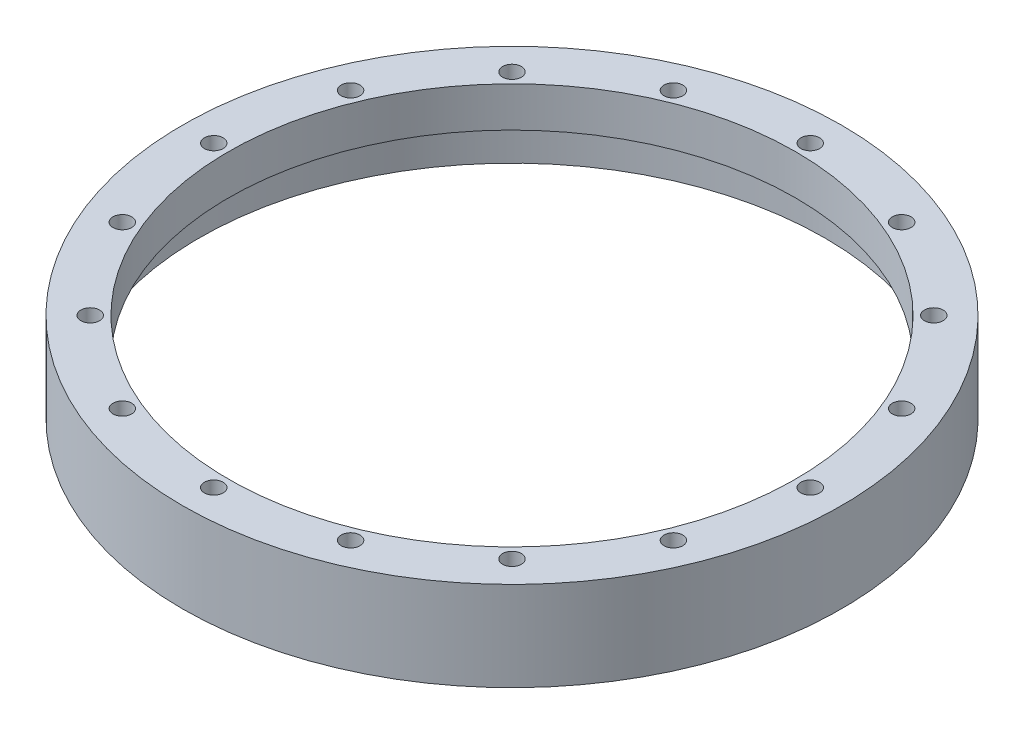
ISO-10303-21;
HEADER;
FILE_DESCRIPTION(('STEP AP214'),'2;1');
FILE_NAME('part.step','',(''),(''),'','','');
FILE_SCHEMA(('AUTOMOTIVE_DESIGN { 1 0 10303 214 1 1 1 1 }'));
ENDSEC;
DATA;
#1=APPLICATION_CONTEXT('core data for automotive mechanical design processes');
#2=APPLICATION_PROTOCOL_DEFINITION('international standard','automotive_design',2000,#1);
#3=PRODUCT_CONTEXT('',#1,'mechanical');
#4=PRODUCT('Part','Part','',(#3));
#5=PRODUCT_RELATED_PRODUCT_CATEGORY('part','',(#4));
#6=PRODUCT_DEFINITION_FORMATION('','',#4);
#7=PRODUCT_DEFINITION_CONTEXT('part definition',#1,'design');
#8=PRODUCT_DEFINITION('design','',#6,#7);
#9=PRODUCT_DEFINITION_SHAPE('','',#8);
#10=(LENGTH_UNIT() NAMED_UNIT(*) SI_UNIT(.MILLI.,.METRE.));
#11=(NAMED_UNIT(*) PLANE_ANGLE_UNIT() SI_UNIT($,.RADIAN.));
#12=(NAMED_UNIT(*) SI_UNIT($,.STERADIAN.) SOLID_ANGLE_UNIT());
#13=UNCERTAINTY_MEASURE_WITH_UNIT(LENGTH_MEASURE(1.E-05),#10,'distance_accuracy_value','');
#14=(GEOMETRIC_REPRESENTATION_CONTEXT(3) GLOBAL_UNCERTAINTY_ASSIGNED_CONTEXT((#13)) GLOBAL_UNIT_ASSIGNED_CONTEXT((#10,
#11,#12)) REPRESENTATION_CONTEXT('',''));
#15=CARTESIAN_POINT('',(0.,0.,0.));
#16=DIRECTION('',(0.,0.,1.));
#17=DIRECTION('',(1.,0.,0.));
#18=AXIS2_PLACEMENT_3D('',#15,#16,#17);
#19=CARTESIAN_POINT('',(-49.4665,0.,0.));
#20=DIRECTION('',(0.,-1.,0.));
#21=DIRECTION('',(0.,0.,-1.));
#22=AXIS2_PLACEMENT_3D('',#19,#20,#21);
#23=PLANE('',#22);
#24=CARTESIAN_POINT('',(-36.7831290718988,0.,-36.7831290718997));
#25=DIRECTION('',(0.,1.,0.));
#26=DIRECTION('',(0.,0.,1.));
#27=AXIS2_PLACEMENT_3D('',#24,#25,#26);
#28=CIRCLE('',#27,1.63195);
#29=CARTESIAN_POINT('',(-36.7831290718988,0.,-35.1511790718997));
#30=VERTEX_POINT('',#29);
#31=EDGE_CURVE('E99',#30,#30,#28,.T.);
#32=ORIENTED_EDGE('',*,*,#31,.F.);
#33=EDGE_LOOP('',(#32));
#34=FACE_BOUND('',#33,.T.);
#35=CARTESIAN_POINT('',(0.,0.,0.));
#36=DIRECTION('',(0.,-1.,0.));
#37=DIRECTION('',(0.,0.,-1.));
#38=AXIS2_PLACEMENT_3D('',#35,#36,#37);
#39=CIRCLE('',#38,49.4665);
#40=CARTESIAN_POINT('',(0.,0.,-49.4665));
#41=VERTEX_POINT('',#40);
#42=EDGE_CURVE('E10',#41,#41,#39,.T.);
#43=ORIENTED_EDGE('',*,*,#42,.T.);
#44=EDGE_LOOP('',(#43));
#45=FACE_BOUND('',#44,.T.);
#46=CARTESIAN_POINT('',(0.,0.,0.));
#47=DIRECTION('',(0.,-1.,0.));
#48=DIRECTION('',(0.,0.,-1.));
#49=AXIS2_PLACEMENT_3D('',#46,#47,#48);
#50=CIRCLE('',#49,57.4802);
#51=CARTESIAN_POINT('',(0.,0.,-57.4802));
#52=VERTEX_POINT('',#51);
#53=EDGE_CURVE('E40',#52,#52,#50,.T.);
#54=ORIENTED_EDGE('',*,*,#53,.F.);
#55=EDGE_LOOP('',(#54));
#56=FACE_BOUND('',#55,.T.);
#57=CARTESIAN_POINT('',(0.,0.,-52.0192));
#58=DIRECTION('',(0.,1.,0.));
#59=DIRECTION('',(0.,0.,1.));
#60=AXIS2_PLACEMENT_3D('',#57,#58,#59);
#61=CIRCLE('',#60,1.63195);
#62=CARTESIAN_POINT('',(0.,0.,-50.38725));
#63=VERTEX_POINT('',#62);
#64=EDGE_CURVE('E139',#63,#63,#61,.T.);
#65=ORIENTED_EDGE('',*,*,#64,.F.);
#66=EDGE_LOOP('',(#65));
#67=FACE_BOUND('',#66,.T.);
#68=CARTESIAN_POINT('',(19.9068860048861,0.,-48.0594741776111));
#69=DIRECTION('',(0.,1.,0.));
#70=DIRECTION('',(0.,0.,1.));
#71=AXIS2_PLACEMENT_3D('',#68,#69,#70);
#72=CIRCLE('',#71,1.63195);
#73=CARTESIAN_POINT('',(19.9068860048861,0.,-46.4275241776111));
#74=VERTEX_POINT('',#73);
#75=EDGE_CURVE('E52',#74,#74,#72,.T.);
#76=ORIENTED_EDGE('',*,*,#75,.F.);
#77=EDGE_LOOP('',(#76));
#78=FACE_BOUND('',#77,.T.);
#79=CARTESIAN_POINT('',(36.7831290718993,0.,-36.7831290718992));
#80=DIRECTION('',(0.,1.,0.));
#81=DIRECTION('',(0.,0.,1.));
#82=AXIS2_PLACEMENT_3D('',#79,#80,#81);
#83=CIRCLE('',#82,1.63195);
#84=CARTESIAN_POINT('',(36.7831290718993,0.,-35.1511790718992));
#85=VERTEX_POINT('',#84);
#86=EDGE_CURVE('E53',#85,#85,#83,.T.);
#87=ORIENTED_EDGE('',*,*,#86,.F.);
#88=EDGE_LOOP('',(#87));
#89=FACE_BOUND('',#88,.T.);
#90=CARTESIAN_POINT('',(48.0594741776112,0.,-19.906886004886));
#91=DIRECTION('',(0.,1.,0.));
#92=DIRECTION('',(0.,0.,1.));
#93=AXIS2_PLACEMENT_3D('',#90,#91,#92);
#94=CIRCLE('',#93,1.63195);
#95=CARTESIAN_POINT('',(48.0594741776112,0.,-18.274936004886));
#96=VERTEX_POINT('',#95);
#97=EDGE_CURVE('E57',#96,#96,#94,.T.);
#98=ORIENTED_EDGE('',*,*,#97,.F.);
#99=EDGE_LOOP('',(#98));
#100=FACE_BOUND('',#99,.T.);
#101=CARTESIAN_POINT('',(52.0192,0.,1.81311555669803E-13));
#102=DIRECTION('',(0.,1.,0.));
#103=DIRECTION('',(0.,0.,1.));
#104=AXIS2_PLACEMENT_3D('',#101,#102,#103);
#105=CIRCLE('',#104,1.63195);
#106=CARTESIAN_POINT('',(52.0192,0.,1.63195000000018));
#107=VERTEX_POINT('',#106);
#108=EDGE_CURVE('E61',#107,#107,#105,.T.);
#109=ORIENTED_EDGE('',*,*,#108,.F.);
#110=EDGE_LOOP('',(#109));
#111=FACE_BOUND('',#110,.T.);
#112=CARTESIAN_POINT('',(48.0594741776111,0.,19.9068860048863));
#113=DIRECTION('',(0.,1.,0.));
#114=DIRECTION('',(0.,0.,1.));
#115=AXIS2_PLACEMENT_3D('',#112,#113,#114);
#116=CIRCLE('',#115,1.63195);
#117=CARTESIAN_POINT('',(48.0594741776111,0.,21.5388360048863));
#118=VERTEX_POINT('',#117);
#119=EDGE_CURVE('E65',#118,#118,#116,.T.);
#120=ORIENTED_EDGE('',*,*,#119,.F.);
#121=EDGE_LOOP('',(#120));
#122=FACE_BOUND('',#121,.T.);
#123=CARTESIAN_POINT('',(36.7831290718991,0.,36.7831290718995));
#124=DIRECTION('',(0.,1.,0.));
#125=DIRECTION('',(0.,0.,1.));
#126=AXIS2_PLACEMENT_3D('',#123,#124,#125);
#127=CIRCLE('',#126,1.63195);
#128=CARTESIAN_POINT('',(36.7831290718991,0.,38.4150790718994));
#129=VERTEX_POINT('',#128);
#130=EDGE_CURVE('E69',#129,#129,#127,.T.);
#131=ORIENTED_EDGE('',*,*,#130,.F.);
#132=EDGE_LOOP('',(#131));
#133=FACE_BOUND('',#132,.T.);
#134=CARTESIAN_POINT('',(19.9068860048858,0.,48.0594741776112));
#135=DIRECTION('',(0.,1.,0.));
#136=DIRECTION('',(0.,0.,1.));
#137=AXIS2_PLACEMENT_3D('',#134,#135,#136);
#138=CIRCLE('',#137,1.63195);
#139=CARTESIAN_POINT('',(19.9068860048858,0.,49.6914241776113));
#140=VERTEX_POINT('',#139);
#141=EDGE_CURVE('E73',#140,#140,#138,.T.);
#142=ORIENTED_EDGE('',*,*,#141,.F.);
#143=EDGE_LOOP('',(#142));
#144=FACE_BOUND('',#143,.T.);
#145=CARTESIAN_POINT('',(-3.62935726928024E-13,0.,52.0192));
#146=DIRECTION('',(0.,1.,0.));
#147=DIRECTION('',(0.,0.,1.));
#148=AXIS2_PLACEMENT_3D('',#145,#146,#147);
#149=CIRCLE('',#148,1.63195);
#150=CARTESIAN_POINT('',(-3.62935726928024E-13,0.,53.65115));
#151=VERTEX_POINT('',#150);
#152=EDGE_CURVE('E77',#151,#151,#149,.T.);
#153=ORIENTED_EDGE('',*,*,#152,.F.);
#154=EDGE_LOOP('',(#153));
#155=FACE_BOUND('',#154,.T.);
#156=CARTESIAN_POINT('',(-19.9068860048865,0.,48.059474177611));
#157=DIRECTION('',(0.,1.,0.));
#158=DIRECTION('',(0.,0.,1.));
#159=AXIS2_PLACEMENT_3D('',#156,#157,#158);
#160=CIRCLE('',#159,1.63195);
#161=CARTESIAN_POINT('',(-19.9068860048865,0.,49.691424177611));
#162=VERTEX_POINT('',#161);
#163=EDGE_CURVE('E81',#162,#162,#160,.T.);
#164=ORIENTED_EDGE('',*,*,#163,.F.);
#165=EDGE_LOOP('',(#164));
#166=FACE_BOUND('',#165,.T.);
#167=CARTESIAN_POINT('',(-36.7831290718996,0.,36.7831290718989));
#168=DIRECTION('',(0.,1.,0.));
#169=DIRECTION('',(0.,0.,1.));
#170=AXIS2_PLACEMENT_3D('',#167,#168,#169);
#171=CIRCLE('',#170,1.63195);
#172=CARTESIAN_POINT('',(-36.7831290718996,0.,38.4150790718989));
#173=VERTEX_POINT('',#172);
#174=EDGE_CURVE('E85',#173,#173,#171,.T.);
#175=ORIENTED_EDGE('',*,*,#174,.F.);
#176=EDGE_LOOP('',(#175));
#177=FACE_BOUND('',#176,.T.);
#178=CARTESIAN_POINT('',(-48.0594741776113,0.,19.9068860048856));
#179=DIRECTION('',(0.,1.,0.));
#180=DIRECTION('',(0.,0.,1.));
#181=AXIS2_PLACEMENT_3D('',#178,#179,#180);
#182=CIRCLE('',#181,1.63195);
#183=CARTESIAN_POINT('',(-48.0594741776113,0.,21.5388360048856));
#184=VERTEX_POINT('',#183);
#185=EDGE_CURVE('E89',#184,#184,#182,.T.);
#186=ORIENTED_EDGE('',*,*,#185,.F.);
#187=EDGE_LOOP('',(#186));
#188=FACE_BOUND('',#187,.T.);
#189=CARTESIAN_POINT('',(-52.0192,0.,-5.44559898186245E-13));
#190=DIRECTION('',(0.,1.,0.));
#191=DIRECTION('',(0.,0.,1.));
#192=AXIS2_PLACEMENT_3D('',#189,#190,#191);
#193=CIRCLE('',#192,1.63195);
#194=CARTESIAN_POINT('',(-52.0192,0.,1.63194999999946));
#195=VERTEX_POINT('',#194);
#196=EDGE_CURVE('E93',#195,#195,#193,.T.);
#197=ORIENTED_EDGE('',*,*,#196,.F.);
#198=EDGE_LOOP('',(#197));
#199=FACE_BOUND('',#198,.T.);
#200=CARTESIAN_POINT('',(-48.0594741776109,0.,-19.9068860048866));
#201=DIRECTION('',(0.,1.,0.));
#202=DIRECTION('',(0.,0.,1.));
#203=AXIS2_PLACEMENT_3D('',#200,#201,#202);
#204=CIRCLE('',#203,1.63195);
#205=CARTESIAN_POINT('',(-48.0594741776109,0.,-18.2749360048866));
#206=VERTEX_POINT('',#205);
#207=EDGE_CURVE('E96',#206,#206,#204,.T.);
#208=ORIENTED_EDGE('',*,*,#207,.F.);
#209=EDGE_LOOP('',(#208));
#210=FACE_BOUND('',#209,.T.);
#211=CARTESIAN_POINT('',(-19.9068860048854,0.,-48.0594741776114));
#212=DIRECTION('',(0.,1.,0.));
#213=DIRECTION('',(0.,0.,1.));
#214=AXIS2_PLACEMENT_3D('',#211,#212,#213);
#215=CIRCLE('',#214,1.63195);
#216=CARTESIAN_POINT('',(-19.9068860048854,0.,-46.4275241776114));
#217=VERTEX_POINT('',#216);
#218=EDGE_CURVE('E109',#217,#217,#215,.T.);
#219=ORIENTED_EDGE('',*,*,#218,.F.);
#220=EDGE_LOOP('',(#219));
#221=FACE_BOUND('',#220,.T.);
#222=ADVANCED_FACE('F32',(#34,#45,#56,#67,#78,#89,#100,#111,#122,#133,#144,#155,#166,#177,#188,
#199,#210,#221),#23,.F.);
#223=CARTESIAN_POINT('',(0.,0.,0.));
#224=DIRECTION('',(0.,-1.,0.));
#225=DIRECTION('',(0.,0.,-1.));
#226=AXIS2_PLACEMENT_3D('',#223,#224,#225);
#227=CYLINDRICAL_SURFACE('',#226,49.4665);
#228=ORIENTED_EDGE('',*,*,#42,.F.);
#229=EDGE_LOOP('',(#228));
#230=FACE_BOUND('',#229,.T.);
#231=CARTESIAN_POINT('',(0.,-6.985,0.));
#232=DIRECTION('',(0.,-1.,0.));
#233=DIRECTION('',(0.,0.,-1.));
#234=AXIS2_PLACEMENT_3D('',#231,#232,#233);
#235=CIRCLE('',#234,49.4665);
#236=CARTESIAN_POINT('',(0.,-6.985,-49.4665));
#237=VERTEX_POINT('',#236);
#238=EDGE_CURVE('E145',#237,#237,#235,.T.);
#239=ORIENTED_EDGE('',*,*,#238,.T.);
#240=EDGE_LOOP('',(#239));
#241=FACE_BOUND('',#240,.T.);
#242=ADVANCED_FACE('F34',(#230,#241),#227,.F.);
#243=CARTESIAN_POINT('',(0.,0.,0.));
#244=DIRECTION('',(0.,-1.,0.));
#245=DIRECTION('',(0.,0.,-1.));
#246=AXIS2_PLACEMENT_3D('',#243,#244,#245);
#247=CYLINDRICAL_SURFACE('',#246,57.4802);
#248=CARTESIAN_POINT('',(0.,-15.5956,0.));
#249=DIRECTION('',(0.,-1.,0.));
#250=DIRECTION('',(0.,0.,-1.));
#251=AXIS2_PLACEMENT_3D('',#248,#249,#250);
#252=CIRCLE('',#251,57.4802);
#253=CARTESIAN_POINT('',(0.,-15.5956,-57.4802));
#254=VERTEX_POINT('',#253);
#255=EDGE_CURVE('E45',#254,#254,#252,.T.);
#256=ORIENTED_EDGE('',*,*,#255,.F.);
#257=EDGE_LOOP('',(#256));
#258=FACE_BOUND('',#257,.T.);
#259=ORIENTED_EDGE('',*,*,#53,.T.);
#260=EDGE_LOOP('',(#259));
#261=FACE_BOUND('',#260,.T.);
#262=ADVANCED_FACE('F158',(#258,#261),#247,.T.);
#263=CARTESIAN_POINT('',(-57.4802,-15.5956,0.));
#264=DIRECTION('',(0.,1.,0.));
#265=DIRECTION('',(0.,0.,1.));
#266=AXIS2_PLACEMENT_3D('',#263,#264,#265);
#267=PLANE('',#266);
#268=CARTESIAN_POINT('',(0.,-15.5956,0.));
#269=DIRECTION('',(0.,-1.,0.));
#270=DIRECTION('',(0.,0.,-1.));
#271=AXIS2_PLACEMENT_3D('',#268,#269,#270);
#272=CIRCLE('',#271,54.5719);
#273=CARTESIAN_POINT('',(0.,-15.5956,-54.5719));
#274=VERTEX_POINT('',#273);
#275=EDGE_CURVE('E151',#274,#274,#272,.T.);
#276=ORIENTED_EDGE('',*,*,#275,.F.);
#277=EDGE_LOOP('',(#276));
#278=FACE_BOUND('',#277,.T.);
#279=ORIENTED_EDGE('',*,*,#255,.T.);
#280=EDGE_LOOP('',(#279));
#281=FACE_BOUND('',#280,.T.);
#282=ADVANCED_FACE('F156',(#278,#281),#267,.F.);
#283=CARTESIAN_POINT('',(0.,0.,0.));
#284=DIRECTION('',(0.,-1.,0.));
#285=DIRECTION('',(0.,0.,-1.));
#286=AXIS2_PLACEMENT_3D('',#283,#284,#285);
#287=CYLINDRICAL_SURFACE('',#286,54.5719);
#288=CARTESIAN_POINT('',(0.,-6.985,0.));
#289=DIRECTION('',(0.,-1.,0.));
#290=DIRECTION('',(0.,0.,-1.));
#291=AXIS2_PLACEMENT_3D('',#288,#289,#290);
#292=CIRCLE('',#291,54.5719);
#293=CARTESIAN_POINT('',(0.,-6.985,-54.5719));
#294=VERTEX_POINT('',#293);
#295=EDGE_CURVE('E148',#294,#294,#292,.T.);
#296=ORIENTED_EDGE('',*,*,#295,.F.);
#297=EDGE_LOOP('',(#296));
#298=FACE_BOUND('',#297,.T.);
#299=ORIENTED_EDGE('',*,*,#275,.T.);
#300=EDGE_LOOP('',(#299));
#301=FACE_BOUND('',#300,.T.);
#302=ADVANCED_FACE('F208',(#298,#301),#287,.F.);
#303=CARTESIAN_POINT('',(-54.5719,-6.985,0.));
#304=DIRECTION('',(0.,1.,0.));
#305=DIRECTION('',(0.,0.,1.));
#306=AXIS2_PLACEMENT_3D('',#303,#304,#305);
#307=PLANE('',#306);
#308=CARTESIAN_POINT('',(-19.9068860048854,-6.985,-48.0594741776114));
#309=DIRECTION('',(0.,1.,0.));
#310=DIRECTION('',(0.,0.,1.));
#311=AXIS2_PLACEMENT_3D('',#308,#309,#310);
#312=CIRCLE('',#311,1.63195);
#313=CARTESIAN_POINT('',(-19.9068860048854,-6.985,-46.4275241776114));
#314=VERTEX_POINT('',#313);
#315=EDGE_CURVE('E36',#314,#314,#312,.T.);
#316=ORIENTED_EDGE('',*,*,#315,.T.);
#317=EDGE_LOOP('',(#316));
#318=FACE_BOUND('',#317,.T.);
#319=CARTESIAN_POINT('',(-36.7831290718988,-6.985,-36.7831290718997));
#320=DIRECTION('',(0.,1.,0.));
#321=DIRECTION('',(0.,0.,1.));
#322=AXIS2_PLACEMENT_3D('',#319,#320,#321);
#323=CIRCLE('',#322,1.63195);
#324=CARTESIAN_POINT('',(-36.7831290718988,-6.985,-35.1511790718997));
#325=VERTEX_POINT('',#324);
#326=EDGE_CURVE('E97',#325,#325,#323,.T.);
#327=ORIENTED_EDGE('',*,*,#326,.T.);
#328=EDGE_LOOP('',(#327));
#329=FACE_BOUND('',#328,.T.);
#330=CARTESIAN_POINT('',(-48.0594741776109,-6.985,-19.9068860048866));
#331=DIRECTION('',(0.,1.,0.));
#332=DIRECTION('',(0.,0.,1.));
#333=AXIS2_PLACEMENT_3D('',#330,#331,#332);
#334=CIRCLE('',#333,1.63195);
#335=CARTESIAN_POINT('',(-48.0594741776109,-6.985,-18.2749360048866));
#336=VERTEX_POINT('',#335);
#337=EDGE_CURVE('E94',#336,#336,#334,.T.);
#338=ORIENTED_EDGE('',*,*,#337,.T.);
#339=EDGE_LOOP('',(#338));
#340=FACE_BOUND('',#339,.T.);
#341=CARTESIAN_POINT('',(-52.0192,-6.985,-5.44559898186245E-13));
#342=DIRECTION('',(0.,1.,0.));
#343=DIRECTION('',(0.,0.,1.));
#344=AXIS2_PLACEMENT_3D('',#341,#342,#343);
#345=CIRCLE('',#344,1.63195);
#346=CARTESIAN_POINT('',(-52.0192,-6.985,1.63194999999946));
#347=VERTEX_POINT('',#346);
#348=EDGE_CURVE('E90',#347,#347,#345,.T.);
#349=ORIENTED_EDGE('',*,*,#348,.T.);
#350=EDGE_LOOP('',(#349));
#351=FACE_BOUND('',#350,.T.);
#352=CARTESIAN_POINT('',(-48.0594741776113,-6.985,19.9068860048856));
#353=DIRECTION('',(0.,1.,0.));
#354=DIRECTION('',(0.,0.,1.));
#355=AXIS2_PLACEMENT_3D('',#352,#353,#354);
#356=CIRCLE('',#355,1.63195);
#357=CARTESIAN_POINT('',(-48.0594741776113,-6.985,21.5388360048856));
#358=VERTEX_POINT('',#357);
#359=EDGE_CURVE('E86',#358,#358,#356,.T.);
#360=ORIENTED_EDGE('',*,*,#359,.T.);
#361=EDGE_LOOP('',(#360));
#362=FACE_BOUND('',#361,.T.);
#363=CARTESIAN_POINT('',(-36.7831290718996,-6.985,36.7831290718989));
#364=DIRECTION('',(0.,1.,0.));
#365=DIRECTION('',(0.,0.,1.));
#366=AXIS2_PLACEMENT_3D('',#363,#364,#365);
#367=CIRCLE('',#366,1.63195);
#368=CARTESIAN_POINT('',(-36.7831290718996,-6.985,38.4150790718989));
#369=VERTEX_POINT('',#368);
#370=EDGE_CURVE('E82',#369,#369,#367,.T.);
#371=ORIENTED_EDGE('',*,*,#370,.T.);
#372=EDGE_LOOP('',(#371));
#373=FACE_BOUND('',#372,.T.);
#374=CARTESIAN_POINT('',(-19.9068860048865,-6.985,48.059474177611));
#375=DIRECTION('',(0.,1.,0.));
#376=DIRECTION('',(0.,0.,1.));
#377=AXIS2_PLACEMENT_3D('',#374,#375,#376);
#378=CIRCLE('',#377,1.63195);
#379=CARTESIAN_POINT('',(-19.9068860048865,-6.985,49.691424177611));
#380=VERTEX_POINT('',#379);
#381=EDGE_CURVE('E78',#380,#380,#378,.T.);
#382=ORIENTED_EDGE('',*,*,#381,.T.);
#383=EDGE_LOOP('',(#382));
#384=FACE_BOUND('',#383,.T.);
#385=CARTESIAN_POINT('',(-3.62935726928024E-13,-6.985,52.0192));
#386=DIRECTION('',(0.,1.,0.));
#387=DIRECTION('',(0.,0.,1.));
#388=AXIS2_PLACEMENT_3D('',#385,#386,#387);
#389=CIRCLE('',#388,1.63195);
#390=CARTESIAN_POINT('',(-3.62935726928024E-13,-6.985,53.65115));
#391=VERTEX_POINT('',#390);
#392=EDGE_CURVE('E74',#391,#391,#389,.T.);
#393=ORIENTED_EDGE('',*,*,#392,.T.);
#394=EDGE_LOOP('',(#393));
#395=FACE_BOUND('',#394,.T.);
#396=CARTESIAN_POINT('',(19.9068860048858,-6.985,48.0594741776112));
#397=DIRECTION('',(0.,1.,0.));
#398=DIRECTION('',(0.,0.,1.));
#399=AXIS2_PLACEMENT_3D('',#396,#397,#398);
#400=CIRCLE('',#399,1.63195);
#401=CARTESIAN_POINT('',(19.9068860048858,-6.985,49.6914241776113));
#402=VERTEX_POINT('',#401);
#403=EDGE_CURVE('E70',#402,#402,#400,.T.);
#404=ORIENTED_EDGE('',*,*,#403,.T.);
#405=EDGE_LOOP('',(#404));
#406=FACE_BOUND('',#405,.T.);
#407=CARTESIAN_POINT('',(36.7831290718991,-6.985,36.7831290718995));
#408=DIRECTION('',(0.,1.,0.));
#409=DIRECTION('',(0.,0.,1.));
#410=AXIS2_PLACEMENT_3D('',#407,#408,#409);
#411=CIRCLE('',#410,1.63195);
#412=CARTESIAN_POINT('',(36.7831290718991,-6.985,38.4150790718994));
#413=VERTEX_POINT('',#412);
#414=EDGE_CURVE('E66',#413,#413,#411,.T.);
#415=ORIENTED_EDGE('',*,*,#414,.T.);
#416=EDGE_LOOP('',(#415));
#417=FACE_BOUND('',#416,.T.);
#418=CARTESIAN_POINT('',(48.0594741776111,-6.985,19.9068860048863));
#419=DIRECTION('',(0.,1.,0.));
#420=DIRECTION('',(0.,0.,1.));
#421=AXIS2_PLACEMENT_3D('',#418,#419,#420);
#422=CIRCLE('',#421,1.63195);
#423=CARTESIAN_POINT('',(48.0594741776111,-6.985,21.5388360048863));
#424=VERTEX_POINT('',#423);
#425=EDGE_CURVE('E62',#424,#424,#422,.T.);
#426=ORIENTED_EDGE('',*,*,#425,.T.);
#427=EDGE_LOOP('',(#426));
#428=FACE_BOUND('',#427,.T.);
#429=CARTESIAN_POINT('',(52.0192,-6.985,1.81311555669803E-13));
#430=DIRECTION('',(0.,1.,0.));
#431=DIRECTION('',(0.,0.,1.));
#432=AXIS2_PLACEMENT_3D('',#429,#430,#431);
#433=CIRCLE('',#432,1.63195);
#434=CARTESIAN_POINT('',(52.0192,-6.985,1.63195000000018));
#435=VERTEX_POINT('',#434);
#436=EDGE_CURVE('E58',#435,#435,#433,.T.);
#437=ORIENTED_EDGE('',*,*,#436,.T.);
#438=EDGE_LOOP('',(#437));
#439=FACE_BOUND('',#438,.T.);
#440=CARTESIAN_POINT('',(48.0594741776112,-6.985,-19.906886004886));
#441=DIRECTION('',(0.,1.,0.));
#442=DIRECTION('',(0.,0.,1.));
#443=AXIS2_PLACEMENT_3D('',#440,#441,#442);
#444=CIRCLE('',#443,1.63195);
#445=CARTESIAN_POINT('',(48.0594741776112,-6.985,-18.274936004886));
#446=VERTEX_POINT('',#445);
#447=EDGE_CURVE('E54',#446,#446,#444,.T.);
#448=ORIENTED_EDGE('',*,*,#447,.T.);
#449=EDGE_LOOP('',(#448));
#450=FACE_BOUND('',#449,.T.);
#451=CARTESIAN_POINT('',(36.7831290718993,-6.985,-36.7831290718992));
#452=DIRECTION('',(0.,1.,0.));
#453=DIRECTION('',(0.,0.,1.));
#454=AXIS2_PLACEMENT_3D('',#451,#452,#453);
#455=CIRCLE('',#454,1.63195);
#456=CARTESIAN_POINT('',(36.7831290718993,-6.985,-35.1511790718992));
#457=VERTEX_POINT('',#456);
#458=EDGE_CURVE('E49',#457,#457,#455,.T.);
#459=ORIENTED_EDGE('',*,*,#458,.T.);
#460=EDGE_LOOP('',(#459));
#461=FACE_BOUND('',#460,.T.);
#462=CARTESIAN_POINT('',(19.9068860048861,-6.985,-48.0594741776111));
#463=DIRECTION('',(0.,1.,0.));
#464=DIRECTION('',(0.,0.,1.));
#465=AXIS2_PLACEMENT_3D('',#462,#463,#464);
#466=CIRCLE('',#465,1.63195);
#467=CARTESIAN_POINT('',(19.9068860048861,-6.985,-46.4275241776111));
#468=VERTEX_POINT('',#467);
#469=EDGE_CURVE('E136',#468,#468,#466,.T.);
#470=ORIENTED_EDGE('',*,*,#469,.T.);
#471=EDGE_LOOP('',(#470));
#472=FACE_BOUND('',#471,.T.);
#473=CARTESIAN_POINT('',(0.,-6.985,-52.0192));
#474=DIRECTION('',(0.,1.,0.));
#475=DIRECTION('',(0.,0.,1.));
#476=AXIS2_PLACEMENT_3D('',#473,#474,#475);
#477=CIRCLE('',#476,1.63195);
#478=CARTESIAN_POINT('',(0.,-6.985,-50.38725));
#479=VERTEX_POINT('',#478);
#480=EDGE_CURVE('E142',#479,#479,#477,.T.);
#481=ORIENTED_EDGE('',*,*,#480,.T.);
#482=EDGE_LOOP('',(#481));
#483=FACE_BOUND('',#482,.T.);
#484=ORIENTED_EDGE('',*,*,#238,.F.);
#485=EDGE_LOOP('',(#484));
#486=FACE_BOUND('',#485,.T.);
#487=ORIENTED_EDGE('',*,*,#295,.T.);
#488=EDGE_LOOP('',(#487));
#489=FACE_BOUND('',#488,.T.);
#490=ADVANCED_FACE('F205',(#318,#329,#340,#351,#362,#373,#384,#395,#406,#417,#428,#439,#450,
#461,#472,#483,#486,#489),#307,.F.);
#491=CARTESIAN_POINT('',(0.,0.,-52.0192));
#492=DIRECTION('',(0.,1.,0.));
#493=DIRECTION('',(0.,0.,1.));
#494=AXIS2_PLACEMENT_3D('',#491,#492,#493);
#495=CYLINDRICAL_SURFACE('',#494,1.63195);
#496=ORIENTED_EDGE('',*,*,#64,.T.);
#497=EDGE_LOOP('',(#496));
#498=FACE_BOUND('',#497,.T.);
#499=ORIENTED_EDGE('',*,*,#480,.F.);
#500=EDGE_LOOP('',(#499));
#501=FACE_BOUND('',#500,.T.);
#502=ADVANCED_FACE('F207',(#498,#501),#495,.F.);
#503=CARTESIAN_POINT('',(19.9068860048861,0.,-48.0594741776111));
#504=DIRECTION('',(0.,1.,0.));
#505=DIRECTION('',(0.,0.,1.));
#506=AXIS2_PLACEMENT_3D('',#503,#504,#505);
#507=CYLINDRICAL_SURFACE('',#506,1.63195);
#508=ORIENTED_EDGE('',*,*,#75,.T.);
#509=EDGE_LOOP('',(#508));
#510=FACE_BOUND('',#509,.T.);
#511=ORIENTED_EDGE('',*,*,#469,.F.);
#512=EDGE_LOOP('',(#511));
#513=FACE_BOUND('',#512,.T.);
#514=ADVANCED_FACE('F255',(#510,#513),#507,.F.);
#515=CARTESIAN_POINT('',(36.7831290718993,0.,-36.7831290718992));
#516=DIRECTION('',(0.,1.,0.));
#517=DIRECTION('',(0.,0.,1.));
#518=AXIS2_PLACEMENT_3D('',#515,#516,#517);
#519=CYLINDRICAL_SURFACE('',#518,1.63195);
#520=ORIENTED_EDGE('',*,*,#86,.T.);
#521=EDGE_LOOP('',(#520));
#522=FACE_BOUND('',#521,.T.);
#523=ORIENTED_EDGE('',*,*,#458,.F.);
#524=EDGE_LOOP('',(#523));
#525=FACE_BOUND('',#524,.T.);
#526=ADVANCED_FACE('F259',(#522,#525),#519,.F.);
#527=CARTESIAN_POINT('',(48.0594741776112,0.,-19.906886004886));
#528=DIRECTION('',(0.,1.,0.));
#529=DIRECTION('',(0.,0.,1.));
#530=AXIS2_PLACEMENT_3D('',#527,#528,#529);
#531=CYLINDRICAL_SURFACE('',#530,1.63195);
#532=ORIENTED_EDGE('',*,*,#97,.T.);
#533=EDGE_LOOP('',(#532));
#534=FACE_BOUND('',#533,.T.);
#535=ORIENTED_EDGE('',*,*,#447,.F.);
#536=EDGE_LOOP('',(#535));
#537=FACE_BOUND('',#536,.T.);
#538=ADVANCED_FACE('F263',(#534,#537),#531,.F.);
#539=CARTESIAN_POINT('',(52.0192,0.,1.81311555669803E-13));
#540=DIRECTION('',(0.,1.,0.));
#541=DIRECTION('',(0.,0.,1.));
#542=AXIS2_PLACEMENT_3D('',#539,#540,#541);
#543=CYLINDRICAL_SURFACE('',#542,1.63195);
#544=ORIENTED_EDGE('',*,*,#108,.T.);
#545=EDGE_LOOP('',(#544));
#546=FACE_BOUND('',#545,.T.);
#547=ORIENTED_EDGE('',*,*,#436,.F.);
#548=EDGE_LOOP('',(#547));
#549=FACE_BOUND('',#548,.T.);
#550=ADVANCED_FACE('F267',(#546,#549),#543,.F.);
#551=CARTESIAN_POINT('',(48.0594741776111,0.,19.9068860048863));
#552=DIRECTION('',(0.,1.,0.));
#553=DIRECTION('',(0.,0.,1.));
#554=AXIS2_PLACEMENT_3D('',#551,#552,#553);
#555=CYLINDRICAL_SURFACE('',#554,1.63195);
#556=ORIENTED_EDGE('',*,*,#119,.T.);
#557=EDGE_LOOP('',(#556));
#558=FACE_BOUND('',#557,.T.);
#559=ORIENTED_EDGE('',*,*,#425,.F.);
#560=EDGE_LOOP('',(#559));
#561=FACE_BOUND('',#560,.T.);
#562=ADVANCED_FACE('F271',(#558,#561),#555,.F.);
#563=CARTESIAN_POINT('',(36.7831290718991,0.,36.7831290718995));
#564=DIRECTION('',(0.,1.,0.));
#565=DIRECTION('',(0.,0.,1.));
#566=AXIS2_PLACEMENT_3D('',#563,#564,#565);
#567=CYLINDRICAL_SURFACE('',#566,1.63195);
#568=ORIENTED_EDGE('',*,*,#130,.T.);
#569=EDGE_LOOP('',(#568));
#570=FACE_BOUND('',#569,.T.);
#571=ORIENTED_EDGE('',*,*,#414,.F.);
#572=EDGE_LOOP('',(#571));
#573=FACE_BOUND('',#572,.T.);
#574=ADVANCED_FACE('F275',(#570,#573),#567,.F.);
#575=CARTESIAN_POINT('',(19.9068860048858,0.,48.0594741776112));
#576=DIRECTION('',(0.,1.,0.));
#577=DIRECTION('',(0.,0.,1.));
#578=AXIS2_PLACEMENT_3D('',#575,#576,#577);
#579=CYLINDRICAL_SURFACE('',#578,1.63195);
#580=ORIENTED_EDGE('',*,*,#141,.T.);
#581=EDGE_LOOP('',(#580));
#582=FACE_BOUND('',#581,.T.);
#583=ORIENTED_EDGE('',*,*,#403,.F.);
#584=EDGE_LOOP('',(#583));
#585=FACE_BOUND('',#584,.T.);
#586=ADVANCED_FACE('F279',(#582,#585),#579,.F.);
#587=CARTESIAN_POINT('',(-3.62935726928024E-13,0.,52.0192));
#588=DIRECTION('',(0.,1.,0.));
#589=DIRECTION('',(0.,0.,1.));
#590=AXIS2_PLACEMENT_3D('',#587,#588,#589);
#591=CYLINDRICAL_SURFACE('',#590,1.63195);
#592=ORIENTED_EDGE('',*,*,#152,.T.);
#593=EDGE_LOOP('',(#592));
#594=FACE_BOUND('',#593,.T.);
#595=ORIENTED_EDGE('',*,*,#392,.F.);
#596=EDGE_LOOP('',(#595));
#597=FACE_BOUND('',#596,.T.);
#598=ADVANCED_FACE('F283',(#594,#597),#591,.F.);
#599=CARTESIAN_POINT('',(-19.9068860048865,0.,48.059474177611));
#600=DIRECTION('',(0.,1.,0.));
#601=DIRECTION('',(0.,0.,1.));
#602=AXIS2_PLACEMENT_3D('',#599,#600,#601);
#603=CYLINDRICAL_SURFACE('',#602,1.63195);
#604=ORIENTED_EDGE('',*,*,#163,.T.);
#605=EDGE_LOOP('',(#604));
#606=FACE_BOUND('',#605,.T.);
#607=ORIENTED_EDGE('',*,*,#381,.F.);
#608=EDGE_LOOP('',(#607));
#609=FACE_BOUND('',#608,.T.);
#610=ADVANCED_FACE('F287',(#606,#609),#603,.F.);
#611=CARTESIAN_POINT('',(-36.7831290718996,0.,36.7831290718989));
#612=DIRECTION('',(0.,1.,0.));
#613=DIRECTION('',(0.,0.,1.));
#614=AXIS2_PLACEMENT_3D('',#611,#612,#613);
#615=CYLINDRICAL_SURFACE('',#614,1.63195);
#616=ORIENTED_EDGE('',*,*,#174,.T.);
#617=EDGE_LOOP('',(#616));
#618=FACE_BOUND('',#617,.T.);
#619=ORIENTED_EDGE('',*,*,#370,.F.);
#620=EDGE_LOOP('',(#619));
#621=FACE_BOUND('',#620,.T.);
#622=ADVANCED_FACE('F291',(#618,#621),#615,.F.);
#623=CARTESIAN_POINT('',(-48.0594741776113,0.,19.9068860048856));
#624=DIRECTION('',(0.,1.,0.));
#625=DIRECTION('',(0.,0.,1.));
#626=AXIS2_PLACEMENT_3D('',#623,#624,#625);
#627=CYLINDRICAL_SURFACE('',#626,1.63195);
#628=ORIENTED_EDGE('',*,*,#185,.T.);
#629=EDGE_LOOP('',(#628));
#630=FACE_BOUND('',#629,.T.);
#631=ORIENTED_EDGE('',*,*,#359,.F.);
#632=EDGE_LOOP('',(#631));
#633=FACE_BOUND('',#632,.T.);
#634=ADVANCED_FACE('F295',(#630,#633),#627,.F.);
#635=CARTESIAN_POINT('',(-52.0192,0.,-5.44559898186245E-13));
#636=DIRECTION('',(0.,1.,0.));
#637=DIRECTION('',(0.,0.,1.));
#638=AXIS2_PLACEMENT_3D('',#635,#636,#637);
#639=CYLINDRICAL_SURFACE('',#638,1.63195);
#640=ORIENTED_EDGE('',*,*,#196,.T.);
#641=EDGE_LOOP('',(#640));
#642=FACE_BOUND('',#641,.T.);
#643=ORIENTED_EDGE('',*,*,#348,.F.);
#644=EDGE_LOOP('',(#643));
#645=FACE_BOUND('',#644,.T.);
#646=ADVANCED_FACE('F299',(#642,#645),#639,.F.);
#647=CARTESIAN_POINT('',(-48.0594741776109,0.,-19.9068860048866));
#648=DIRECTION('',(0.,1.,0.));
#649=DIRECTION('',(0.,0.,1.));
#650=AXIS2_PLACEMENT_3D('',#647,#648,#649);
#651=CYLINDRICAL_SURFACE('',#650,1.63195);
#652=ORIENTED_EDGE('',*,*,#207,.T.);
#653=EDGE_LOOP('',(#652));
#654=FACE_BOUND('',#653,.T.);
#655=ORIENTED_EDGE('',*,*,#337,.F.);
#656=EDGE_LOOP('',(#655));
#657=FACE_BOUND('',#656,.T.);
#658=ADVANCED_FACE('F303',(#654,#657),#651,.F.);
#659=CARTESIAN_POINT('',(-36.7831290718988,0.,-36.7831290718997));
#660=DIRECTION('',(0.,1.,0.));
#661=DIRECTION('',(0.,0.,1.));
#662=AXIS2_PLACEMENT_3D('',#659,#660,#661);
#663=CYLINDRICAL_SURFACE('',#662,1.63195);
#664=ORIENTED_EDGE('',*,*,#31,.T.);
#665=EDGE_LOOP('',(#664));
#666=FACE_BOUND('',#665,.T.);
#667=ORIENTED_EDGE('',*,*,#326,.F.);
#668=EDGE_LOOP('',(#667));
#669=FACE_BOUND('',#668,.T.);
#670=ADVANCED_FACE('F201',(#666,#669),#663,.F.);
#671=CARTESIAN_POINT('',(-19.9068860048854,0.,-48.0594741776114));
#672=DIRECTION('',(0.,1.,0.));
#673=DIRECTION('',(0.,0.,1.));
#674=AXIS2_PLACEMENT_3D('',#671,#672,#673);
#675=CYLINDRICAL_SURFACE('',#674,1.63195);
#676=ORIENTED_EDGE('',*,*,#218,.T.);
#677=EDGE_LOOP('',(#676));
#678=FACE_BOUND('',#677,.T.);
#679=ORIENTED_EDGE('',*,*,#315,.F.);
#680=EDGE_LOOP('',(#679));
#681=FACE_BOUND('',#680,.T.);
#682=ADVANCED_FACE('F198',(#678,#681),#675,.F.);
#683=CLOSED_SHELL('',(#222,#242,#262,#282,#302,#490,#502,#514,#526,#538,#550,#562,#574,#586,
#598,#610,#622,#634,#646,#658,#670,#682));
#684=MANIFOLD_SOLID_BREP('B2',#683);
#685=ADVANCED_BREP_SHAPE_REPRESENTATION('',(#18,#684),#14);
#686=SHAPE_DEFINITION_REPRESENTATION(#9,#685);
ENDSEC;
END-ISO-10303-21;
